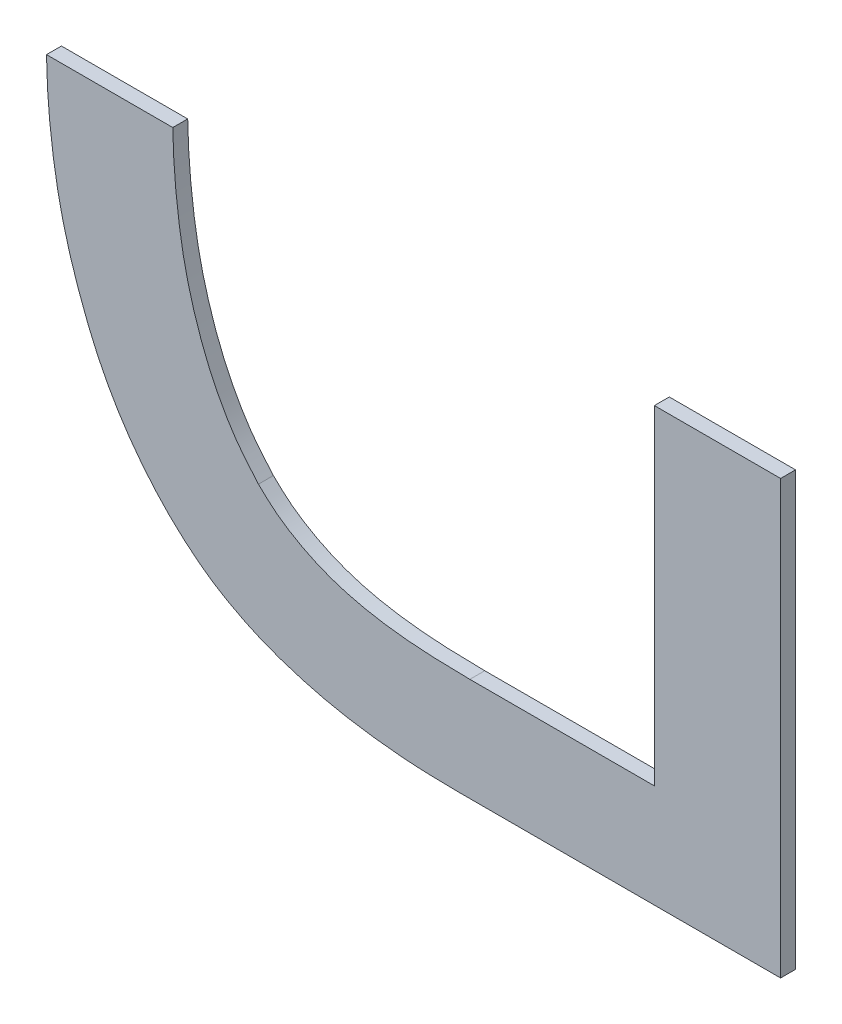
ISO-10303-21;
HEADER;
FILE_DESCRIPTION(('STEP AP214'),'2;1');
FILE_NAME('part.step','',(''),(''),'','','');
FILE_SCHEMA(('AUTOMOTIVE_DESIGN { 1 0 10303 214 1 1 1 1 }'));
ENDSEC;
DATA;
#1=APPLICATION_CONTEXT('core data for automotive mechanical design processes');
#2=APPLICATION_PROTOCOL_DEFINITION('international standard','automotive_design',2000,#1);
#3=PRODUCT_CONTEXT('',#1,'mechanical');
#4=PRODUCT('Part','Part','',(#3));
#5=PRODUCT_RELATED_PRODUCT_CATEGORY('part','',(#4));
#6=PRODUCT_DEFINITION_FORMATION('','',#4);
#7=PRODUCT_DEFINITION_CONTEXT('part definition',#1,'design');
#8=PRODUCT_DEFINITION('design','',#6,#7);
#9=PRODUCT_DEFINITION_SHAPE('','',#8);
#10=(LENGTH_UNIT() NAMED_UNIT(*) SI_UNIT(.MILLI.,.METRE.));
#11=(NAMED_UNIT(*) PLANE_ANGLE_UNIT() SI_UNIT($,.RADIAN.));
#12=(NAMED_UNIT(*) SI_UNIT($,.STERADIAN.) SOLID_ANGLE_UNIT());
#13=UNCERTAINTY_MEASURE_WITH_UNIT(LENGTH_MEASURE(1.E-05),#10,'distance_accuracy_value','');
#14=(GEOMETRIC_REPRESENTATION_CONTEXT(3) GLOBAL_UNCERTAINTY_ASSIGNED_CONTEXT((#13)) GLOBAL_UNIT_ASSIGNED_CONTEXT((#10,
#11,#12)) REPRESENTATION_CONTEXT('',''));
#15=CARTESIAN_POINT('',(0.,0.,0.));
#16=DIRECTION('',(0.,0.,1.));
#17=DIRECTION('',(1.,0.,0.));
#18=AXIS2_PLACEMENT_3D('',#15,#16,#17);
#19=CARTESIAN_POINT('',(0.793269230769248,-15.,0.5));
#20=DIRECTION('',(0.,1.,0.));
#21=DIRECTION('',(0.,0.,1.));
#22=AXIS2_PLACEMENT_3D('',#19,#20,#21);
#23=PLANE('',#22);
#24=DIRECTION('',(1.,0.,0.));
#25=VECTOR('',#24,1.);
#26=CARTESIAN_POINT('',(0.793269230769248,-15.,0.));
#27=LINE('',#26,#25);
#28=CARTESIAN_POINT('',(0.793269230769248,-15.,0.));
#29=VERTEX_POINT('',#28);
#30=CARTESIAN_POINT('',(11.5384615384616,-15.,0.));
#31=VERTEX_POINT('',#30);
#32=EDGE_CURVE('E99',#29,#31,#27,.T.);
#33=ORIENTED_EDGE('',*,*,#32,.T.);
#34=DIRECTION('',(0.,0.,-1.));
#35=VECTOR('',#34,1.);
#36=CARTESIAN_POINT('',(11.5384615384616,-15.,0.5));
#37=LINE('',#36,#35);
#38=CARTESIAN_POINT('',(11.5384615384616,-15.,0.5));
#39=VERTEX_POINT('',#38);
#40=EDGE_CURVE('E50',#39,#31,#37,.T.);
#41=ORIENTED_EDGE('',*,*,#40,.F.);
#42=DIRECTION('',(1.,0.,0.));
#43=VECTOR('',#42,1.);
#44=CARTESIAN_POINT('',(0.793269230769248,-15.,0.5));
#45=LINE('',#44,#43);
#46=CARTESIAN_POINT('',(0.793269230769248,-15.,0.5));
#47=VERTEX_POINT('',#46);
#48=EDGE_CURVE('E104',#47,#39,#45,.T.);
#49=ORIENTED_EDGE('',*,*,#48,.F.);
#50=DIRECTION('',(0.,0.,-1.));
#51=VECTOR('',#50,1.);
#52=CARTESIAN_POINT('',(0.793269230769248,-15.,0.5));
#53=LINE('',#52,#51);
#54=EDGE_CURVE('E111',#47,#29,#53,.T.);
#55=ORIENTED_EDGE('',*,*,#54,.T.);
#56=EDGE_LOOP('',(#33,#41,#49,#55));
#57=FACE_BOUND('',#56,.T.);
#58=ADVANCED_FACE('F39',(#57),#23,.F.);
#59=CARTESIAN_POINT('',(7.30769230769232,-11.5384615384615,0.5));
#60=DIRECTION('',(0.,-1.,0.));
#61=DIRECTION('',(0.,0.,-1.));
#62=AXIS2_PLACEMENT_3D('',#59,#60,#61);
#63=PLANE('',#62);
#64=DIRECTION('',(-1.,0.,0.));
#65=VECTOR('',#64,1.);
#66=CARTESIAN_POINT('',(7.30769230769232,-11.5384615384615,0.));
#67=LINE('',#66,#65);
#68=CARTESIAN_POINT('',(7.30769230769232,-11.5384615384615,0.));
#69=VERTEX_POINT('',#68);
#70=CARTESIAN_POINT('',(1.12379807692309,-11.5384615384615,0.));
#71=VERTEX_POINT('',#70);
#72=EDGE_CURVE('E242',#69,#71,#67,.T.);
#73=ORIENTED_EDGE('',*,*,#72,.T.);
#74=DIRECTION('',(0.,0.,-1.));
#75=VECTOR('',#74,1.);
#76=CARTESIAN_POINT('',(1.12379807692309,-11.5384615384615,0.5));
#77=LINE('',#76,#75);
#78=CARTESIAN_POINT('',(1.12379807692309,-11.5384615384615,0.5));
#79=VERTEX_POINT('',#78);
#80=EDGE_CURVE('E227',#79,#71,#77,.T.);
#81=ORIENTED_EDGE('',*,*,#80,.F.);
#82=DIRECTION('',(-1.,0.,0.));
#83=VECTOR('',#82,1.);
#84=CARTESIAN_POINT('',(7.30769230769232,-11.5384615384615,0.5));
#85=LINE('',#84,#83);
#86=CARTESIAN_POINT('',(7.30769230769232,-11.5384615384615,0.5));
#87=VERTEX_POINT('',#86);
#88=EDGE_CURVE('E177',#87,#79,#85,.T.);
#89=ORIENTED_EDGE('',*,*,#88,.F.);
#90=DIRECTION('',(0.,0.,-1.));
#91=VECTOR('',#90,1.);
#92=CARTESIAN_POINT('',(7.30769230769232,-11.5384615384615,0.5));
#93=LINE('',#92,#91);
#94=EDGE_CURVE('E180',#87,#69,#93,.T.);
#95=ORIENTED_EDGE('',*,*,#94,.T.);
#96=EDGE_LOOP('',(#73,#81,#89,#95));
#97=FACE_BOUND('',#96,.T.);
#98=ADVANCED_FACE('F207',(#97),#63,.F.);
#99=CARTESIAN_POINT('',(1.12379807692309,-11.5384615384615,0.5));
#100=CARTESIAN_POINT('',(0.672883893219106,-11.53171153589,0.5));
#101=CARTESIAN_POINT('',(-0.18014527902953,-11.5189420349198,0.5));
#102=CARTESIAN_POINT('',(-1.38363473872739,-11.4208726325041,0.5));
#103=CARTESIAN_POINT('',(-2.43400368785341,-11.2517160748215,0.5));
#104=CARTESIAN_POINT('',(-3.34289958024592,-11.0110519552441,0.5));
#105=CARTESIAN_POINT('',(-4.13150863625797,-10.6998362918708,0.5));
#106=CARTESIAN_POINT('',(-4.82588276770224,-10.331905039365,0.5));
#107=CARTESIAN_POINT('',(-5.44353722790646,-9.91438576616343,0.5));
#108=CARTESIAN_POINT('',(-5.79146206483372,-9.58035288683749,0.5));
#109=CARTESIAN_POINT('',(-5.96153846153845,-9.41706730769231,0.5));
#110=B_SPLINE_CURVE_WITH_KNOTS('',3,(#99,#100,#101,#102,#103,#104,#105,#106,#107,#108,#109),
.UNSPECIFIED.,.F.,.F.,(4,1,1,1,1,1,1,1,4),(0.,0.177956152998803,0.336653392985248,
0.47612152675217,0.597333917982928,0.707007299684123,0.80992965843641,0.907087751771142,1.),.UNSPECIFIED.);
#111=DIRECTION('',(0.,0.,-1.));
#112=VECTOR('',#111,1.);
#113=SURFACE_OF_LINEAR_EXTRUSION('',#110,#112);
#114=CARTESIAN_POINT('',(1.12379807692309,-11.5384615384615,0.));
#115=CARTESIAN_POINT('',(0.672883893219106,-11.53171153589,0.));
#116=CARTESIAN_POINT('',(-0.18014527902953,-11.5189420349198,0.));
#117=CARTESIAN_POINT('',(-1.38363473872739,-11.4208726325041,0.));
#118=CARTESIAN_POINT('',(-2.43400368785341,-11.2517160748215,0.));
#119=CARTESIAN_POINT('',(-3.34289958024592,-11.0110519552441,0.));
#120=CARTESIAN_POINT('',(-4.13150863625797,-10.6998362918708,0.));
#121=CARTESIAN_POINT('',(-4.82588276770224,-10.331905039365,0.));
#122=CARTESIAN_POINT('',(-5.44353722790646,-9.91438576616343,0.));
#123=CARTESIAN_POINT('',(-5.79146206483372,-9.58035288683749,0.));
#124=CARTESIAN_POINT('',(-5.96153846153845,-9.41706730769231,0.));
#125=B_SPLINE_CURVE_WITH_KNOTS('',3,(#114,#115,#116,#117,#118,#119,#120,#121,#122,#123,#124),
.UNSPECIFIED.,.F.,.F.,(4,1,1,1,1,1,1,1,4),(0.,0.177956152998803,0.336653392985248,
0.47612152675217,0.597333917982928,0.707007299684123,0.80992965843641,0.907087751771142,1.),.UNSPECIFIED.);
#126=CARTESIAN_POINT('',(-5.96153846153845,-9.41706730769231,0.));
#127=VERTEX_POINT('',#126);
#128=EDGE_CURVE('E182',#71,#127,#125,.T.);
#129=ORIENTED_EDGE('',*,*,#128,.T.);
#130=DIRECTION('',(0.,0.,-1.));
#131=VECTOR('',#130,1.);
#132=CARTESIAN_POINT('',(-5.96153846153845,-9.41706730769231,0.5));
#133=LINE('',#132,#131);
#134=CARTESIAN_POINT('',(-5.96153846153845,-9.41706730769231,0.5));
#135=VERTEX_POINT('',#134);
#136=EDGE_CURVE('E103',#135,#127,#133,.T.);
#137=ORIENTED_EDGE('',*,*,#136,.F.);
#138=EDGE_CURVE('E185',#79,#135,#110,.T.);
#139=ORIENTED_EDGE('',*,*,#138,.F.);
#140=ORIENTED_EDGE('',*,*,#80,.T.);
#141=EDGE_LOOP('',(#129,#137,#139,#140));
#142=FACE_BOUND('',#141,.T.);
#143=ADVANCED_FACE('F202',(#142),#113,.F.);
#144=CARTESIAN_POINT('',(-5.96153846153844,-9.41706730769231,0.5));
#145=CARTESIAN_POINT('',(-6.18285895721648,-9.16400403470436,0.5));
#146=CARTESIAN_POINT('',(-6.63752737732019,-8.64412503225045,0.5));
#147=CARTESIAN_POINT('',(-7.20370747921905,-7.73592407078347,0.5));
#148=CARTESIAN_POINT('',(-7.69744409577687,-6.71402408998613,0.5));
#149=CARTESIAN_POINT('',(-8.11017985173129,-5.5675463380685,0.5));
#150=CARTESIAN_POINT('',(-8.44861249042261,-4.30036863483023,0.5));
#151=CARTESIAN_POINT('',(-8.6743341500256,-2.90114069947784,0.5));
#152=CARTESIAN_POINT('',(-8.82191286500081,-1.37937663732752,0.5));
#153=CARTESIAN_POINT('',(-8.83787229905006,-0.320894201924811,0.5));
#154=CARTESIAN_POINT('',(-8.84615384615383,0.228365384615384,0.5));
#155=B_SPLINE_CURVE_WITH_KNOTS('',3,(#144,#145,#146,#147,#148,#149,#150,#151,#152,#153,#154),
.UNSPECIFIED.,.F.,.F.,(4,1,1,1,1,1,1,1,4),(0.,0.097773091427871,0.200859558315992,
0.31044138568368,0.427816075551052,0.555168385743887,0.691833743392282,0.840088729837451,1.),.UNSPECIFIED.);
#156=DIRECTION('',(0.,0.,-1.));
#157=VECTOR('',#156,1.);
#158=SURFACE_OF_LINEAR_EXTRUSION('',#155,#157);
#159=CARTESIAN_POINT('',(-5.96153846153844,-9.41706730769231,0.));
#160=CARTESIAN_POINT('',(-6.18285895721648,-9.16400403470436,0.));
#161=CARTESIAN_POINT('',(-6.63752737732019,-8.64412503225045,0.));
#162=CARTESIAN_POINT('',(-7.20370747921905,-7.73592407078347,0.));
#163=CARTESIAN_POINT('',(-7.69744409577687,-6.71402408998613,0.));
#164=CARTESIAN_POINT('',(-8.11017985173129,-5.5675463380685,0.));
#165=CARTESIAN_POINT('',(-8.44861249042261,-4.30036863483023,0.));
#166=CARTESIAN_POINT('',(-8.6743341500256,-2.90114069947784,0.));
#167=CARTESIAN_POINT('',(-8.82191286500081,-1.37937663732752,0.));
#168=CARTESIAN_POINT('',(-8.83787229905006,-0.320894201924811,0.));
#169=CARTESIAN_POINT('',(-8.84615384615383,0.228365384615384,0.));
#170=B_SPLINE_CURVE_WITH_KNOTS('',3,(#159,#160,#161,#162,#163,#164,#165,#166,#167,#168,#169),
.UNSPECIFIED.,.F.,.F.,(4,1,1,1,1,1,1,1,4),(0.,0.097773091427871,0.200859558315992,
0.31044138568368,0.427816075551052,0.555168385743887,0.691833743392282,0.840088729837451,1.),.UNSPECIFIED.);
#171=CARTESIAN_POINT('',(-8.83316297779313,-0.5,0.));
#172=VERTEX_POINT('',#171);
#173=EDGE_CURVE('E179',#127,#172,#170,.T.);
#174=ORIENTED_EDGE('',*,*,#173,.T.);
#175=DIRECTION('',(0.,0.,-1.));
#176=VECTOR('',#175,1.);
#177=CARTESIAN_POINT('',(-8.83316297779312,-0.5,0.5));
#178=LINE('',#177,#176);
#179=CARTESIAN_POINT('',(-8.83316297779322,-0.499999999995857,0.5));
#180=VERTEX_POINT('',#179);
#181=EDGE_CURVE('E11',#172,#180,#178,.F.);
#182=ORIENTED_EDGE('',*,*,#181,.T.);
#183=EDGE_CURVE('E195',#135,#180,#155,.T.);
#184=ORIENTED_EDGE('',*,*,#183,.F.);
#185=ORIENTED_EDGE('',*,*,#136,.T.);
#186=EDGE_LOOP('',(#174,#182,#184,#185));
#187=FACE_BOUND('',#186,.T.);
#188=ADVANCED_FACE('F203',(#187),#158,.F.);
#189=CARTESIAN_POINT('',(7.30769230769232,11.5384615384615,0.5));
#190=DIRECTION('',(1.,0.,0.));
#191=DIRECTION('',(0.,0.,-1.));
#192=AXIS2_PLACEMENT_3D('',#189,#190,#191);
#193=PLANE('',#192);
#194=DIRECTION('',(0.,-1.,0.));
#195=VECTOR('',#194,1.);
#196=CARTESIAN_POINT('',(7.30769230769232,11.5384615384615,0.5));
#197=LINE('',#196,#195);
#198=CARTESIAN_POINT('',(7.30769230769232,-0.5,0.5));
#199=VERTEX_POINT('',#198);
#200=EDGE_CURVE('E174',#199,#87,#197,.T.);
#201=ORIENTED_EDGE('',*,*,#200,.F.);
#202=DIRECTION('',(0.,0.,-1.));
#203=VECTOR('',#202,1.);
#204=CARTESIAN_POINT('',(7.30769230769232,-0.5,0.5));
#205=LINE('',#204,#203);
#206=CARTESIAN_POINT('',(7.30769230769232,-0.5,0.));
#207=VERTEX_POINT('',#206);
#208=EDGE_CURVE('E138',#199,#207,#205,.T.);
#209=ORIENTED_EDGE('',*,*,#208,.T.);
#210=DIRECTION('',(0.,-1.,0.));
#211=VECTOR('',#210,1.);
#212=CARTESIAN_POINT('',(7.30769230769232,11.5384615384615,0.));
#213=LINE('',#212,#211);
#214=EDGE_CURVE('E81',#207,#69,#213,.T.);
#215=ORIENTED_EDGE('',*,*,#214,.T.);
#216=ORIENTED_EDGE('',*,*,#94,.F.);
#217=EDGE_LOOP('',(#201,#209,#215,#216));
#218=FACE_BOUND('',#217,.T.);
#219=ADVANCED_FACE('F176',(#218),#193,.F.);
#220=CARTESIAN_POINT('',(-1.382682115,14.9217036371468,0.5));
#221=DIRECTION('',(0.,0.,-1.));
#222=DIRECTION('',(-1.,0.,0.));
#223=AXIS2_PLACEMENT_3D('',#220,#221,#222);
#224=PLANE('',#223);
#225=DIRECTION('',(0.,1.,0.));
#226=VECTOR('',#225,1.);
#227=CARTESIAN_POINT('',(11.5384615384616,-15.,0.5));
#228=LINE('',#227,#226);
#229=CARTESIAN_POINT('',(11.5384615384616,-0.5,0.5));
#230=VERTEX_POINT('',#229);
#231=EDGE_CURVE('E160',#39,#230,#228,.T.);
#232=ORIENTED_EDGE('',*,*,#231,.T.);
#233=DIRECTION('',(-1.,0.,0.));
#234=VECTOR('',#233,1.);
#235=CARTESIAN_POINT('',(-1.382682115,-0.5,0.5));
#236=LINE('',#235,#234);
#237=EDGE_CURVE('E76',#230,#199,#236,.T.);
#238=ORIENTED_EDGE('',*,*,#237,.T.);
#239=ORIENTED_EDGE('',*,*,#200,.T.);
#240=ORIENTED_EDGE('',*,*,#88,.T.);
#241=ORIENTED_EDGE('',*,*,#138,.T.);
#242=ORIENTED_EDGE('',*,*,#183,.T.);
#243=CARTESIAN_POINT('',(-13.0657572381693,-0.5,0.5));
#244=VERTEX_POINT('',#243);
#245=EDGE_CURVE('E65',#180,#244,#236,.T.);
#246=ORIENTED_EDGE('',*,*,#245,.T.);
#247=CARTESIAN_POINT('',(-13.0769230769231,0.162259615384614,0.5));
#248=CARTESIAN_POINT('',(-13.0688644097837,-0.391013998422333,0.5));
#249=CARTESIAN_POINT('',(-13.0531824332498,-1.46767142556582,0.5));
#250=CARTESIAN_POINT('',(-12.8980936559159,-3.0336496090541,0.5));
#251=CARTESIAN_POINT('',(-12.6581069410923,-4.50561782726538,0.5));
#252=CARTESIAN_POINT('',(-12.3088402453961,-5.87473737302881,0.5));
#253=CARTESIAN_POINT('',(-11.8786818415884,-7.13341462043438,0.5));
#254=CARTESIAN_POINT('',(-11.4094163674244,-8.29192947413631,0.5));
#255=CARTESIAN_POINT('',(-10.8692584571758,-9.3303196777004,0.5));
#256=CARTESIAN_POINT('',(-10.2767173432877,-10.2573629302694,0.5));
#257=CARTESIAN_POINT('',(-9.64182524491146,-11.0789247670745,0.5));
#258=CARTESIAN_POINT('',(-8.97670040251232,-11.8073354211414,0.5));
#259=CARTESIAN_POINT('',(-8.27937117315819,-12.4429172181902,0.5));
#260=CARTESIAN_POINT('',(-7.55337982312949,-13.0023503643188,0.5));
#261=CARTESIAN_POINT('',(-6.76102162609978,-13.4655763917189,0.5));
#262=CARTESIAN_POINT('',(-5.91060909642983,-13.88151434409,0.5));
#263=CARTESIAN_POINT('',(-4.9745521287399,-14.2157203316221,0.5));
#264=CARTESIAN_POINT('',(-3.97047844072853,-14.5080576852388,0.5));
#265=CARTESIAN_POINT('',(-2.88659472187527,-14.7270697911197,0.5));
#266=CARTESIAN_POINT('',(-1.72877025745535,-14.8880069337675,0.5));
#267=CARTESIAN_POINT('',(-0.492454720954551,-14.985327640061,0.5));
#268=CARTESIAN_POINT('',(0.356390803515191,-14.9950144527325,0.5));
#269=CARTESIAN_POINT('',(0.793269230769248,-15.,0.5));
#270=B_SPLINE_CURVE_WITH_KNOTS('',3,(#247,#248,#249,#250,#251,#252,#253,#254,#255,#256,#257,
#258,#259,#260,#261,#262,#263,#264,#265,#266,#267,#268,#269),.UNSPECIFIED.,.F.,.F.,(4,1,1,1,1,1,
1,1,1,1,1,1,1,1,1,1,1,1,1,1,4),(0.,0.0705376913485883,0.137264686745954,0.200471780051464,
0.260572650738638,0.317203332832266,0.370005966596039,0.41982407694872,0.466240566668154,
0.510133573231235,0.552081050730299,0.591862964258205,0.630336393410436,0.668715563305118,
0.708706092482775,0.750895576667682,0.795285350377417,0.841980098316745,0.891764792381472,
0.944294190268085,1.),.UNSPECIFIED.);
#271=EDGE_CURVE('E140',#244,#47,#270,.T.);
#272=ORIENTED_EDGE('',*,*,#271,.T.);
#273=ORIENTED_EDGE('',*,*,#48,.T.);
#274=EDGE_LOOP('',(#232,#238,#239,#240,#241,#242,#246,#272,#273));
#275=FACE_BOUND('',#274,.T.);
#276=ADVANCED_FACE('F175',(#275),#224,.F.);
#277=DIRECTION('',(0.,0.,-1.));
#278=VECTOR('',#277,1.);
#279=SURFACE_OF_LINEAR_EXTRUSION('',#270,#278);
#280=ORIENTED_EDGE('',*,*,#271,.F.);
#281=DIRECTION('',(0.,0.,-1.));
#282=VECTOR('',#281,1.);
#283=CARTESIAN_POINT('',(-13.0657572379605,-0.5,0.5));
#284=LINE('',#283,#282);
#285=CARTESIAN_POINT('',(-13.0650586722682,-0.50001563980658,-5.87115958281385E-06));
#286=VERTEX_POINT('',#285);
#287=EDGE_CURVE('E124',#244,#286,#284,.T.);
#288=ORIENTED_EDGE('',*,*,#287,.T.);
#289=CARTESIAN_POINT('',(-13.0769230769231,0.162259615384614,0.));
#290=CARTESIAN_POINT('',(-13.0688644097837,-0.391013998422333,0.));
#291=CARTESIAN_POINT('',(-13.0531824332498,-1.46767142556582,0.));
#292=CARTESIAN_POINT('',(-12.8980936559159,-3.0336496090541,0.));
#293=CARTESIAN_POINT('',(-12.6581069410923,-4.50561782726538,0.));
#294=CARTESIAN_POINT('',(-12.3088402453961,-5.87473737302881,0.));
#295=CARTESIAN_POINT('',(-11.8786818415884,-7.13341462043438,0.));
#296=CARTESIAN_POINT('',(-11.4094163674244,-8.29192947413631,0.));
#297=CARTESIAN_POINT('',(-10.8692584571758,-9.3303196777004,0.));
#298=CARTESIAN_POINT('',(-10.2767173432877,-10.2573629302694,0.));
#299=CARTESIAN_POINT('',(-9.64182524491146,-11.0789247670745,0.));
#300=CARTESIAN_POINT('',(-8.97670040251232,-11.8073354211414,0.));
#301=CARTESIAN_POINT('',(-8.27937117315819,-12.4429172181902,0.));
#302=CARTESIAN_POINT('',(-7.55337982312949,-13.0023503643188,0.));
#303=CARTESIAN_POINT('',(-6.76102162609978,-13.4655763917189,0.));
#304=CARTESIAN_POINT('',(-5.91060909642983,-13.88151434409,0.));
#305=CARTESIAN_POINT('',(-4.9745521287399,-14.2157203316221,0.));
#306=CARTESIAN_POINT('',(-3.97047844072853,-14.5080576852388,0.));
#307=CARTESIAN_POINT('',(-2.88659472187527,-14.7270697911197,0.));
#308=CARTESIAN_POINT('',(-1.72877025745535,-14.8880069337675,0.));
#309=CARTESIAN_POINT('',(-0.492454720954551,-14.985327640061,0.));
#310=CARTESIAN_POINT('',(0.356390803515191,-14.9950144527325,0.));
#311=CARTESIAN_POINT('',(0.793269230769248,-15.,0.));
#312=B_SPLINE_CURVE_WITH_KNOTS('',3,(#289,#290,#291,#292,#293,#294,#295,#296,#297,#298,#299,
#300,#301,#302,#303,#304,#305,#306,#307,#308,#309,#310,#311),.UNSPECIFIED.,.F.,.F.,(4,1,1,1,1,1,
1,1,1,1,1,1,1,1,1,1,1,1,1,1,4),(0.,0.0705376913485883,0.137264686745954,0.200471780051464,
0.260572650738638,0.317203332832266,0.370005966596039,0.41982407694872,0.466240566668154,
0.510133573231235,0.552081050730299,0.591862964258205,0.630336393410436,0.668715563305118,
0.708706092482775,0.750895576667682,0.795285350377417,0.841980098316745,0.891764792381472,
0.944294190268085,1.),.UNSPECIFIED.);
#313=EDGE_CURVE('E98',#286,#29,#312,.T.);
#314=ORIENTED_EDGE('',*,*,#313,.T.);
#315=ORIENTED_EDGE('',*,*,#54,.F.);
#316=EDGE_LOOP('',(#280,#288,#314,#315));
#317=FACE_BOUND('',#316,.T.);
#318=ADVANCED_FACE('F135',(#317),#279,.F.);
#319=CARTESIAN_POINT('',(11.5384615384616,-15.,0.5));
#320=DIRECTION('',(-1.,0.,0.));
#321=DIRECTION('',(0.,0.,1.));
#322=AXIS2_PLACEMENT_3D('',#319,#320,#321);
#323=PLANE('',#322);
#324=DIRECTION('',(0.,1.,0.));
#325=VECTOR('',#324,1.);
#326=CARTESIAN_POINT('',(11.5384615384616,-15.,0.));
#327=LINE('',#326,#325);
#328=CARTESIAN_POINT('',(11.5384615384616,-0.5,0.));
#329=VERTEX_POINT('',#328);
#330=EDGE_CURVE('E91',#31,#329,#327,.T.);
#331=ORIENTED_EDGE('',*,*,#330,.T.);
#332=DIRECTION('',(0.,0.,1.));
#333=VECTOR('',#332,1.);
#334=CARTESIAN_POINT('',(11.5384615384616,-0.5,0.5));
#335=LINE('',#334,#333);
#336=EDGE_CURVE('E71',#329,#230,#335,.T.);
#337=ORIENTED_EDGE('',*,*,#336,.T.);
#338=ORIENTED_EDGE('',*,*,#231,.F.);
#339=ORIENTED_EDGE('',*,*,#40,.T.);
#340=EDGE_LOOP('',(#331,#337,#338,#339));
#341=FACE_BOUND('',#340,.T.);
#342=ADVANCED_FACE('F96',(#341),#323,.F.);
#343=CARTESIAN_POINT('',(-1.382682115,14.9217036371468,0.));
#344=DIRECTION('',(0.,0.,-1.));
#345=DIRECTION('',(-1.,0.,0.));
#346=AXIS2_PLACEMENT_3D('',#343,#344,#345);
#347=PLANE('',#346);
#348=DIRECTION('',(-1.,0.,0.));
#349=VECTOR('',#348,1.);
#350=CARTESIAN_POINT('',(-1.382682115,-0.5,0.));
#351=LINE('',#350,#349);
#352=EDGE_CURVE('E45',#329,#207,#351,.T.);
#353=ORIENTED_EDGE('',*,*,#352,.F.);
#354=ORIENTED_EDGE('',*,*,#330,.F.);
#355=ORIENTED_EDGE('',*,*,#32,.F.);
#356=ORIENTED_EDGE('',*,*,#313,.F.);
#357=DIRECTION('',(-1.,0.,0.));
#358=VECTOR('',#357,1.);
#359=CARTESIAN_POINT('',(-1.382682115,-0.5,0.));
#360=LINE('',#359,#358);
#361=EDGE_CURVE('E94',#172,#286,#360,.T.);
#362=ORIENTED_EDGE('',*,*,#361,.F.);
#363=ORIENTED_EDGE('',*,*,#173,.F.);
#364=ORIENTED_EDGE('',*,*,#128,.F.);
#365=ORIENTED_EDGE('',*,*,#72,.F.);
#366=ORIENTED_EDGE('',*,*,#214,.F.);
#367=EDGE_LOOP('',(#353,#354,#355,#356,#362,#363,#364,#365,#366));
#368=FACE_BOUND('',#367,.T.);
#369=ADVANCED_FACE('F88',(#368),#347,.T.);
#370=CARTESIAN_POINT('',(-17.,-0.5,1.));
#371=DIRECTION('',(0.,-1.,0.));
#372=DIRECTION('',(0.,0.,-1.));
#373=AXIS2_PLACEMENT_3D('',#370,#371,#372);
#374=PLANE('',#373);
#375=ORIENTED_EDGE('',*,*,#245,.F.);
#376=ORIENTED_EDGE('',*,*,#181,.F.);
#377=ORIENTED_EDGE('',*,*,#361,.T.);
#378=ORIENTED_EDGE('',*,*,#287,.F.);
#379=EDGE_LOOP('',(#375,#376,#377,#378));
#380=FACE_BOUND('',#379,.T.);
#381=ADVANCED_FACE('F121',(#380),#374,.F.);
#382=ORIENTED_EDGE('',*,*,#352,.T.);
#383=ORIENTED_EDGE('',*,*,#208,.F.);
#384=ORIENTED_EDGE('',*,*,#237,.F.);
#385=ORIENTED_EDGE('',*,*,#336,.F.);
#386=EDGE_LOOP('',(#382,#383,#384,#385));
#387=FACE_BOUND('',#386,.T.);
#388=ADVANCED_FACE('F73',(#387),#374,.F.);
#389=CLOSED_SHELL('',(#58,#98,#143,#188,#219,#276,#318,#342,#369,#381,#388));
#390=MANIFOLD_SOLID_BREP('B2',#389);
#391=ADVANCED_BREP_SHAPE_REPRESENTATION('',(#18,#390),#14);
#392=SHAPE_DEFINITION_REPRESENTATION(#9,#391);
ENDSEC;
END-ISO-10303-21;
